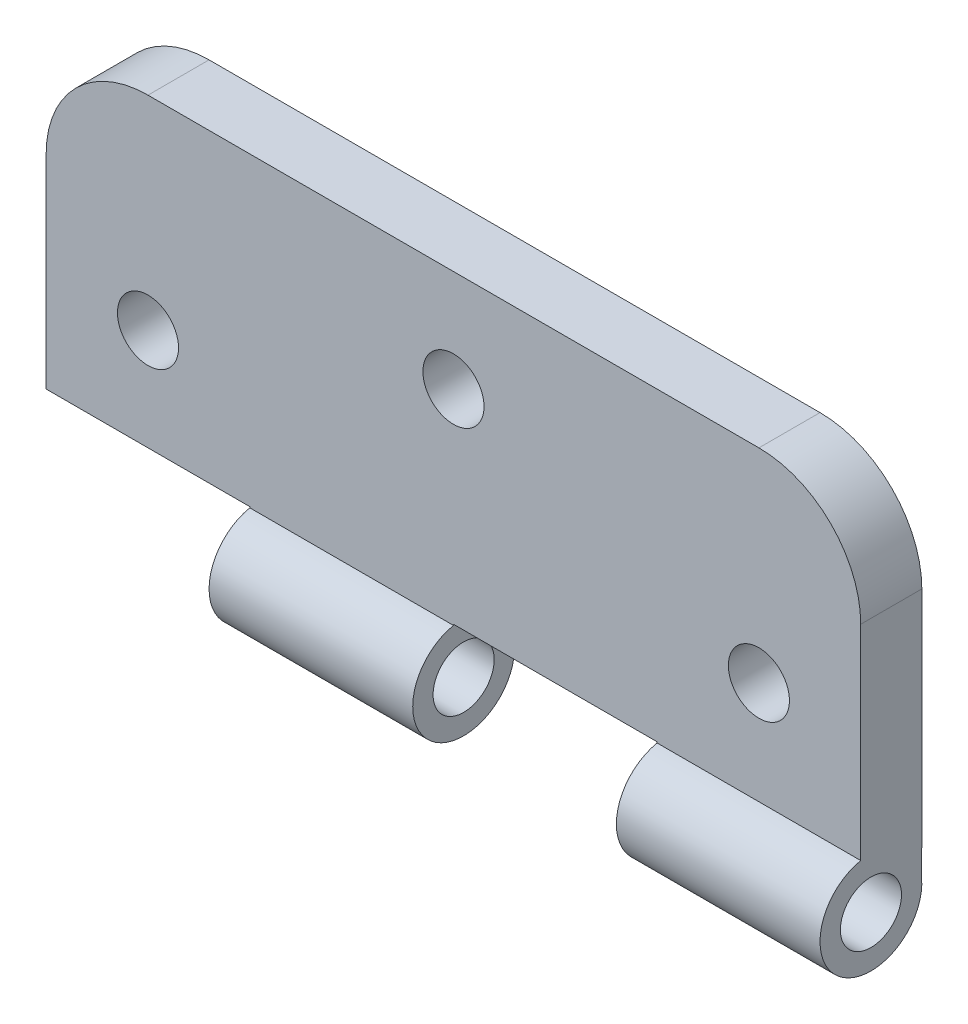
ISO-10303-21;
HEADER;
FILE_DESCRIPTION(('STEP AP214'),'2;1');
FILE_NAME('part.step','',(''),(''),'','','');
FILE_SCHEMA(('AUTOMOTIVE_DESIGN { 1 0 10303 214 1 1 1 1 }'));
ENDSEC;
DATA;
#1=APPLICATION_CONTEXT('core data for automotive mechanical design processes');
#2=APPLICATION_PROTOCOL_DEFINITION('international standard','automotive_design',2000,#1);
#3=PRODUCT_CONTEXT('',#1,'mechanical');
#4=PRODUCT('Part','Part','',(#3));
#5=PRODUCT_RELATED_PRODUCT_CATEGORY('part','',(#4));
#6=PRODUCT_DEFINITION_FORMATION('','',#4);
#7=PRODUCT_DEFINITION_CONTEXT('part definition',#1,'design');
#8=PRODUCT_DEFINITION('design','',#6,#7);
#9=PRODUCT_DEFINITION_SHAPE('','',#8);
#10=(LENGTH_UNIT() NAMED_UNIT(*) SI_UNIT(.MILLI.,.METRE.));
#11=(NAMED_UNIT(*) PLANE_ANGLE_UNIT() SI_UNIT($,.RADIAN.));
#12=(NAMED_UNIT(*) SI_UNIT($,.STERADIAN.) SOLID_ANGLE_UNIT());
#13=UNCERTAINTY_MEASURE_WITH_UNIT(LENGTH_MEASURE(1.E-05),#10,'distance_accuracy_value','');
#14=(GEOMETRIC_REPRESENTATION_CONTEXT(3) GLOBAL_UNCERTAINTY_ASSIGNED_CONTEXT((#13)) GLOBAL_UNIT_ASSIGNED_CONTEXT((#10,
#11,#12)) REPRESENTATION_CONTEXT('',''));
#15=CARTESIAN_POINT('',(0.,0.,0.));
#16=DIRECTION('',(0.,0.,1.));
#17=DIRECTION('',(1.,0.,0.));
#18=AXIS2_PLACEMENT_3D('',#15,#16,#17);
#19=CARTESIAN_POINT('',(-20.,-7.5,3.));
#20=DIRECTION('',(0.,1.,0.));
#21=DIRECTION('',(0.,0.,1.));
#22=AXIS2_PLACEMENT_3D('',#19,#20,#21);
#23=PLANE('',#22);
#24=DIRECTION('',(0.,0.,-1.));
#25=VECTOR('',#24,1.);
#26=CARTESIAN_POINT('',(-10.,-7.5,0.));
#27=LINE('',#26,#25);
#28=CARTESIAN_POINT('',(-10.,-7.5,3.));
#29=VERTEX_POINT('',#28);
#30=CARTESIAN_POINT('',(-10.,-7.5,0.));
#31=VERTEX_POINT('',#30);
#32=EDGE_CURVE('E56',#29,#31,#27,.T.);
#33=ORIENTED_EDGE('',*,*,#32,.F.);
#34=DIRECTION('',(1.,0.,0.));
#35=VECTOR('',#34,1.);
#36=CARTESIAN_POINT('',(-20.,-7.5,3.));
#37=LINE('',#36,#35);
#38=CARTESIAN_POINT('',(-20.,-7.5,3.));
#39=VERTEX_POINT('',#38);
#40=EDGE_CURVE('E151',#39,#29,#37,.T.);
#41=ORIENTED_EDGE('',*,*,#40,.F.);
#42=DIRECTION('',(0.,0.,-1.));
#43=VECTOR('',#42,1.);
#44=CARTESIAN_POINT('',(-20.,-7.5,3.));
#45=LINE('',#44,#43);
#46=CARTESIAN_POINT('',(-20.,-7.5,0.));
#47=VERTEX_POINT('',#46);
#48=EDGE_CURVE('E236',#39,#47,#45,.T.);
#49=ORIENTED_EDGE('',*,*,#48,.T.);
#50=DIRECTION('',(1.,0.,0.));
#51=VECTOR('',#50,1.);
#52=CARTESIAN_POINT('',(-20.,-7.5,0.));
#53=LINE('',#52,#51);
#54=EDGE_CURVE('E227',#47,#31,#53,.T.);
#55=ORIENTED_EDGE('',*,*,#54,.T.);
#56=EDGE_LOOP('',(#33,#41,#49,#55));
#57=FACE_BOUND('',#56,.T.);
#58=ADVANCED_FACE('F33',(#57),#23,.F.);
#59=CARTESIAN_POINT('',(0.,-7.5,3.));
#60=VERTEX_POINT('',#59);
#61=CARTESIAN_POINT('',(9.99999999999999,-7.5,3.));
#62=VERTEX_POINT('',#61);
#63=EDGE_CURVE('E48',#60,#62,#37,.T.);
#64=ORIENTED_EDGE('',*,*,#63,.F.);
#65=DIRECTION('',(0.,0.,-1.));
#66=VECTOR('',#65,1.);
#67=CARTESIAN_POINT('',(0.,-7.5,0.));
#68=LINE('',#67,#66);
#69=CARTESIAN_POINT('',(0.,-7.5,0.));
#70=VERTEX_POINT('',#69);
#71=EDGE_CURVE('E155',#60,#70,#68,.T.);
#72=ORIENTED_EDGE('',*,*,#71,.T.);
#73=CARTESIAN_POINT('',(9.99999999999999,-7.5,0.));
#74=VERTEX_POINT('',#73);
#75=EDGE_CURVE('E247',#70,#74,#53,.T.);
#76=ORIENTED_EDGE('',*,*,#75,.T.);
#77=DIRECTION('',(0.,0.,-1.));
#78=VECTOR('',#77,1.);
#79=CARTESIAN_POINT('',(9.99999999999999,-7.5,0.));
#80=LINE('',#79,#78);
#81=EDGE_CURVE('E187',#62,#74,#80,.T.);
#82=ORIENTED_EDGE('',*,*,#81,.F.);
#83=EDGE_LOOP('',(#64,#72,#76,#82));
#84=FACE_BOUND('',#83,.T.);
#85=ADVANCED_FACE('F292',(#84),#23,.F.);
#86=CARTESIAN_POINT('',(-15.,2.5,3.));
#87=DIRECTION('',(0.,0.,1.));
#88=DIRECTION('',(1.,0.,0.));
#89=AXIS2_PLACEMENT_3D('',#86,#87,#88);
#90=PLANE('',#89);
#91=CARTESIAN_POINT('',(15.,-2.5,3.));
#92=DIRECTION('',(0.,0.,1.));
#93=DIRECTION('',(-1.,0.,0.));
#94=AXIS2_PLACEMENT_3D('',#91,#92,#93);
#95=CIRCLE('',#94,1.5);
#96=CARTESIAN_POINT('',(13.5,-2.5,3.));
#97=VERTEX_POINT('',#96);
#98=EDGE_CURVE('E212',#97,#97,#95,.T.);
#99=ORIENTED_EDGE('',*,*,#98,.F.);
#100=EDGE_LOOP('',(#99));
#101=FACE_BOUND('',#100,.T.);
#102=DIRECTION('',(0.,1.,0.));
#103=VECTOR('',#102,1.);
#104=CARTESIAN_POINT('',(20.,2.49999999999997,3.));
#105=LINE('',#104,#103);
#106=CARTESIAN_POINT('',(20.,-7.55051025721682,3.));
#107=VERTEX_POINT('',#106);
#108=CARTESIAN_POINT('',(20.,2.49999999999997,3.));
#109=VERTEX_POINT('',#108);
#110=EDGE_CURVE('E224',#107,#109,#105,.T.);
#111=ORIENTED_EDGE('',*,*,#110,.T.);
#112=CARTESIAN_POINT('',(15.,2.5,3.));
#113=DIRECTION('',(0.,0.,1.));
#114=DIRECTION('',(-1.,0.,0.));
#115=AXIS2_PLACEMENT_3D('',#112,#113,#114);
#116=CIRCLE('',#115,5.);
#117=CARTESIAN_POINT('',(15.,7.5,3.));
#118=VERTEX_POINT('',#117);
#119=EDGE_CURVE('E226',#109,#118,#116,.T.);
#120=ORIENTED_EDGE('',*,*,#119,.T.);
#121=DIRECTION('',(-1.,0.,0.));
#122=VECTOR('',#121,1.);
#123=CARTESIAN_POINT('',(-15.,7.5,3.));
#124=LINE('',#123,#122);
#125=CARTESIAN_POINT('',(-15.,7.5,3.));
#126=VERTEX_POINT('',#125);
#127=EDGE_CURVE('E229',#118,#126,#124,.T.);
#128=ORIENTED_EDGE('',*,*,#127,.T.);
#129=CARTESIAN_POINT('',(-15.,2.5,3.));
#130=DIRECTION('',(0.,0.,1.));
#131=DIRECTION('',(1.,0.,0.));
#132=AXIS2_PLACEMENT_3D('',#129,#130,#131);
#133=CIRCLE('',#132,5.);
#134=CARTESIAN_POINT('',(-20.,2.49999999999997,3.));
#135=VERTEX_POINT('',#134);
#136=EDGE_CURVE('E231',#126,#135,#133,.T.);
#137=ORIENTED_EDGE('',*,*,#136,.T.);
#138=DIRECTION('',(0.,-1.,0.));
#139=VECTOR('',#138,1.);
#140=CARTESIAN_POINT('',(-20.,2.49999999999997,3.));
#141=LINE('',#140,#139);
#142=EDGE_CURVE('E233',#135,#39,#141,.T.);
#143=ORIENTED_EDGE('',*,*,#142,.T.);
#144=ORIENTED_EDGE('',*,*,#40,.T.);
#145=DIRECTION('',(0.,-1.,0.));
#146=VECTOR('',#145,1.);
#147=CARTESIAN_POINT('',(-10.,0.,3.));
#148=LINE('',#147,#146);
#149=CARTESIAN_POINT('',(-10.,-7.55051025721682,3.));
#150=VERTEX_POINT('',#149);
#151=EDGE_CURVE('E143',#29,#150,#148,.T.);
#152=ORIENTED_EDGE('',*,*,#151,.T.);
#153=DIRECTION('',(1.,0.,0.));
#154=VECTOR('',#153,1.);
#155=CARTESIAN_POINT('',(-10.,-7.55051025721682,3.));
#156=LINE('',#155,#154);
#157=CARTESIAN_POINT('',(0.,-7.55051025721682,3.));
#158=VERTEX_POINT('',#157);
#159=EDGE_CURVE('E128',#150,#158,#156,.T.);
#160=ORIENTED_EDGE('',*,*,#159,.T.);
#161=DIRECTION('',(0.,-1.,0.));
#162=VECTOR('',#161,1.);
#163=CARTESIAN_POINT('',(0.,0.,3.));
#164=LINE('',#163,#162);
#165=EDGE_CURVE('E163',#60,#158,#164,.T.);
#166=ORIENTED_EDGE('',*,*,#165,.F.);
#167=ORIENTED_EDGE('',*,*,#63,.T.);
#168=DIRECTION('',(0.,-1.,0.));
#169=VECTOR('',#168,1.);
#170=CARTESIAN_POINT('',(9.99999999999999,0.,3.));
#171=LINE('',#170,#169);
#172=CARTESIAN_POINT('',(9.99999999999999,-7.55051025721682,3.));
#173=VERTEX_POINT('',#172);
#174=EDGE_CURVE('E178',#62,#173,#171,.T.);
#175=ORIENTED_EDGE('',*,*,#174,.T.);
#176=DIRECTION('',(1.,0.,0.));
#177=VECTOR('',#176,1.);
#178=CARTESIAN_POINT('',(9.99999999999999,-7.55051025721682,3.));
#179=LINE('',#178,#177);
#180=EDGE_CURVE('E190',#173,#107,#179,.T.);
#181=ORIENTED_EDGE('',*,*,#180,.T.);
#182=EDGE_LOOP('',(#111,#120,#128,#137,#143,#144,#152,#160,#166,#167,#175,#181));
#183=FACE_BOUND('',#182,.T.);
#184=CARTESIAN_POINT('',(-15.,-2.5,3.));
#185=DIRECTION('',(0.,0.,1.));
#186=DIRECTION('',(1.,0.,0.));
#187=AXIS2_PLACEMENT_3D('',#184,#185,#186);
#188=CIRCLE('',#187,1.5);
#189=CARTESIAN_POINT('',(-13.5,-2.5,3.));
#190=VERTEX_POINT('',#189);
#191=EDGE_CURVE('E218',#190,#190,#188,.T.);
#192=ORIENTED_EDGE('',*,*,#191,.F.);
#193=EDGE_LOOP('',(#192));
#194=FACE_BOUND('',#193,.T.);
#195=CARTESIAN_POINT('',(0.,2.5,3.));
#196=DIRECTION('',(0.,0.,1.));
#197=DIRECTION('',(1.,0.,0.));
#198=AXIS2_PLACEMENT_3D('',#195,#196,#197);
#199=CIRCLE('',#198,1.5);
#200=CARTESIAN_POINT('',(1.5,2.5,3.));
#201=VERTEX_POINT('',#200);
#202=EDGE_CURVE('E206',#201,#201,#199,.T.);
#203=ORIENTED_EDGE('',*,*,#202,.F.);
#204=EDGE_LOOP('',(#203));
#205=FACE_BOUND('',#204,.T.);
#206=ADVANCED_FACE('F149',(#101,#183,#194,#205),#90,.T.);
#207=CARTESIAN_POINT('',(-15.,2.5,0.));
#208=DIRECTION('',(0.,0.,1.));
#209=DIRECTION('',(1.,0.,0.));
#210=AXIS2_PLACEMENT_3D('',#207,#208,#209);
#211=PLANE('',#210);
#212=DIRECTION('',(0.,1.,0.));
#213=VECTOR('',#212,1.);
#214=CARTESIAN_POINT('',(20.,2.49999999999997,0.));
#215=LINE('',#214,#213);
#216=CARTESIAN_POINT('',(20.,-7.5,0.));
#217=VERTEX_POINT('',#216);
#218=CARTESIAN_POINT('',(20.,2.49999999999997,0.));
#219=VERTEX_POINT('',#218);
#220=EDGE_CURVE('E221',#217,#219,#215,.T.);
#221=ORIENTED_EDGE('',*,*,#220,.F.);
#222=DIRECTION('',(1.,0.,0.));
#223=VECTOR('',#222,1.);
#224=CARTESIAN_POINT('',(9.99999999999999,-7.5,0.));
#225=LINE('',#224,#223);
#226=EDGE_CURVE('E198',#74,#217,#225,.T.);
#227=ORIENTED_EDGE('',*,*,#226,.F.);
#228=ORIENTED_EDGE('',*,*,#75,.F.);
#229=DIRECTION('',(1.,0.,0.));
#230=VECTOR('',#229,1.);
#231=CARTESIAN_POINT('',(-10.,-7.5,0.));
#232=LINE('',#231,#230);
#233=EDGE_CURVE('E170',#31,#70,#232,.T.);
#234=ORIENTED_EDGE('',*,*,#233,.F.);
#235=ORIENTED_EDGE('',*,*,#54,.F.);
#236=DIRECTION('',(0.,-1.,0.));
#237=VECTOR('',#236,1.);
#238=CARTESIAN_POINT('',(-20.,2.49999999999997,0.));
#239=LINE('',#238,#237);
#240=CARTESIAN_POINT('',(-20.,2.49999999999997,0.));
#241=VERTEX_POINT('',#240);
#242=EDGE_CURVE('E245',#241,#47,#239,.T.);
#243=ORIENTED_EDGE('',*,*,#242,.F.);
#244=CARTESIAN_POINT('',(-15.,2.5,0.));
#245=DIRECTION('',(0.,0.,1.));
#246=DIRECTION('',(1.,0.,0.));
#247=AXIS2_PLACEMENT_3D('',#244,#245,#246);
#248=CIRCLE('',#247,5.);
#249=CARTESIAN_POINT('',(-15.,7.5,0.));
#250=VERTEX_POINT('',#249);
#251=EDGE_CURVE('E243',#250,#241,#248,.T.);
#252=ORIENTED_EDGE('',*,*,#251,.F.);
#253=DIRECTION('',(-1.,0.,0.));
#254=VECTOR('',#253,1.);
#255=CARTESIAN_POINT('',(-15.,7.5,0.));
#256=LINE('',#255,#254);
#257=CARTESIAN_POINT('',(15.,7.5,0.));
#258=VERTEX_POINT('',#257);
#259=EDGE_CURVE('E241',#258,#250,#256,.T.);
#260=ORIENTED_EDGE('',*,*,#259,.F.);
#261=CARTESIAN_POINT('',(15.,2.5,0.));
#262=DIRECTION('',(0.,0.,1.));
#263=DIRECTION('',(-1.,0.,0.));
#264=AXIS2_PLACEMENT_3D('',#261,#262,#263);
#265=CIRCLE('',#264,5.);
#266=EDGE_CURVE('E239',#219,#258,#265,.T.);
#267=ORIENTED_EDGE('',*,*,#266,.F.);
#268=EDGE_LOOP('',(#221,#227,#228,#234,#235,#243,#252,#260,#267));
#269=FACE_BOUND('',#268,.T.);
#270=CARTESIAN_POINT('',(-15.,-2.5,0.));
#271=DIRECTION('',(0.,0.,1.));
#272=DIRECTION('',(1.,0.,0.));
#273=AXIS2_PLACEMENT_3D('',#270,#271,#272);
#274=CIRCLE('',#273,1.5);
#275=CARTESIAN_POINT('',(-13.5,-2.5,0.));
#276=VERTEX_POINT('',#275);
#277=EDGE_CURVE('E215',#276,#276,#274,.T.);
#278=ORIENTED_EDGE('',*,*,#277,.T.);
#279=EDGE_LOOP('',(#278));
#280=FACE_BOUND('',#279,.T.);
#281=CARTESIAN_POINT('',(15.,-2.5,0.));
#282=DIRECTION('',(0.,0.,1.));
#283=DIRECTION('',(-1.,0.,0.));
#284=AXIS2_PLACEMENT_3D('',#281,#282,#283);
#285=CIRCLE('',#284,1.5);
#286=CARTESIAN_POINT('',(13.5,-2.5,0.));
#287=VERTEX_POINT('',#286);
#288=EDGE_CURVE('E209',#287,#287,#285,.T.);
#289=ORIENTED_EDGE('',*,*,#288,.T.);
#290=EDGE_LOOP('',(#289));
#291=FACE_BOUND('',#290,.T.);
#292=CARTESIAN_POINT('',(0.,2.5,0.));
#293=DIRECTION('',(0.,0.,1.));
#294=DIRECTION('',(1.,0.,0.));
#295=AXIS2_PLACEMENT_3D('',#292,#293,#294);
#296=CIRCLE('',#295,1.5);
#297=CARTESIAN_POINT('',(1.5,2.5,0.));
#298=VERTEX_POINT('',#297);
#299=EDGE_CURVE('E201',#298,#298,#296,.T.);
#300=ORIENTED_EDGE('',*,*,#299,.T.);
#301=EDGE_LOOP('',(#300));
#302=FACE_BOUND('',#301,.T.);
#303=ADVANCED_FACE('F266',(#269,#280,#291,#302),#211,.F.);
#304=CARTESIAN_POINT('',(20.,2.49999999999997,3.));
#305=DIRECTION('',(-1.,0.,0.));
#306=DIRECTION('',(0.,0.,1.));
#307=AXIS2_PLACEMENT_3D('',#304,#305,#306);
#308=PLANE('',#307);
#309=ORIENTED_EDGE('',*,*,#220,.T.);
#310=DIRECTION('',(0.,0.,-1.));
#311=VECTOR('',#310,1.);
#312=CARTESIAN_POINT('',(20.,2.49999999999997,3.));
#313=LINE('',#312,#311);
#314=EDGE_CURVE('E11',#109,#219,#313,.T.);
#315=ORIENTED_EDGE('',*,*,#314,.F.);
#316=ORIENTED_EDGE('',*,*,#110,.F.);
#317=CARTESIAN_POINT('',(20.,-10.,2.5));
#318=DIRECTION('',(1.,0.,0.));
#319=DIRECTION('',(0.,0.,-1.));
#320=AXIS2_PLACEMENT_3D('',#317,#318,#319);
#321=CIRCLE('',#320,2.5);
#322=CARTESIAN_POINT('',(20.,-9.78241924590967,0.00948627479198817));
#323=VERTEX_POINT('',#322);
#324=EDGE_CURVE('E193',#107,#323,#321,.T.);
#325=ORIENTED_EDGE('',*,*,#324,.T.);
#326=DIRECTION('',(0.,-0.999991362959859,0.0041562008713571));
#327=VECTOR('',#326,1.);
#328=CARTESIAN_POINT('',(20.,-0.000129555042623021,-0.031171237305625));
#329=LINE('',#328,#327);
#330=EDGE_CURVE('E179',#217,#323,#329,.T.);
#331=ORIENTED_EDGE('',*,*,#330,.F.);
#332=EDGE_LOOP('',(#309,#315,#316,#325,#331));
#333=FACE_BOUND('',#332,.T.);
#334=CARTESIAN_POINT('',(20.,-10.,2.5));
#335=DIRECTION('',(1.,0.,0.));
#336=DIRECTION('',(0.,0.,-1.));
#337=AXIS2_PLACEMENT_3D('',#334,#335,#336);
#338=CIRCLE('',#337,1.5);
#339=CARTESIAN_POINT('',(20.,-10.,1.));
#340=VERTEX_POINT('',#339);
#341=EDGE_CURVE('E173',#340,#340,#338,.T.);
#342=ORIENTED_EDGE('',*,*,#341,.F.);
#343=EDGE_LOOP('',(#342));
#344=FACE_BOUND('',#343,.T.);
#345=ADVANCED_FACE('F35',(#333,#344),#308,.F.);
#346=CARTESIAN_POINT('',(15.,2.5,3.));
#347=DIRECTION('',(0.,0.,-1.));
#348=DIRECTION('',(-1.,0.,0.));
#349=AXIS2_PLACEMENT_3D('',#346,#347,#348);
#350=CYLINDRICAL_SURFACE('',#349,5.);
#351=ORIENTED_EDGE('',*,*,#266,.T.);
#352=DIRECTION('',(0.,0.,-1.));
#353=VECTOR('',#352,1.);
#354=CARTESIAN_POINT('',(15.,7.5,3.));
#355=LINE('',#354,#353);
#356=EDGE_CURVE('E41',#118,#258,#355,.T.);
#357=ORIENTED_EDGE('',*,*,#356,.F.);
#358=ORIENTED_EDGE('',*,*,#119,.F.);
#359=ORIENTED_EDGE('',*,*,#314,.T.);
#360=EDGE_LOOP('',(#351,#357,#358,#359));
#361=FACE_BOUND('',#360,.T.);
#362=ADVANCED_FACE('F279',(#361),#350,.T.);
#363=CARTESIAN_POINT('',(-15.,7.5,3.));
#364=DIRECTION('',(0.,-1.,0.));
#365=DIRECTION('',(0.,0.,-1.));
#366=AXIS2_PLACEMENT_3D('',#363,#364,#365);
#367=PLANE('',#366);
#368=ORIENTED_EDGE('',*,*,#259,.T.);
#369=DIRECTION('',(0.,0.,-1.));
#370=VECTOR('',#369,1.);
#371=CARTESIAN_POINT('',(-15.,7.5,3.));
#372=LINE('',#371,#370);
#373=EDGE_CURVE('E254',#126,#250,#372,.T.);
#374=ORIENTED_EDGE('',*,*,#373,.F.);
#375=ORIENTED_EDGE('',*,*,#127,.F.);
#376=ORIENTED_EDGE('',*,*,#356,.T.);
#377=EDGE_LOOP('',(#368,#374,#375,#376));
#378=FACE_BOUND('',#377,.T.);
#379=ADVANCED_FACE('F261',(#378),#367,.F.);
#380=CARTESIAN_POINT('',(-15.,2.5,3.));
#381=DIRECTION('',(0.,0.,-1.));
#382=DIRECTION('',(-1.,0.,0.));
#383=AXIS2_PLACEMENT_3D('',#380,#381,#382);
#384=CYLINDRICAL_SURFACE('',#383,5.);
#385=ORIENTED_EDGE('',*,*,#251,.T.);
#386=DIRECTION('',(0.,0.,-1.));
#387=VECTOR('',#386,1.);
#388=CARTESIAN_POINT('',(-20.,2.49999999999997,3.));
#389=LINE('',#388,#387);
#390=EDGE_CURVE('E251',#135,#241,#389,.T.);
#391=ORIENTED_EDGE('',*,*,#390,.F.);
#392=ORIENTED_EDGE('',*,*,#136,.F.);
#393=ORIENTED_EDGE('',*,*,#373,.T.);
#394=EDGE_LOOP('',(#385,#391,#392,#393));
#395=FACE_BOUND('',#394,.T.);
#396=ADVANCED_FACE('F272',(#395),#384,.T.);
#397=CARTESIAN_POINT('',(-20.,2.49999999999997,3.));
#398=DIRECTION('',(1.,0.,0.));
#399=DIRECTION('',(0.,1.,0.));
#400=AXIS2_PLACEMENT_3D('',#397,#398,#399);
#401=PLANE('',#400);
#402=ORIENTED_EDGE('',*,*,#242,.T.);
#403=ORIENTED_EDGE('',*,*,#48,.F.);
#404=ORIENTED_EDGE('',*,*,#142,.F.);
#405=ORIENTED_EDGE('',*,*,#390,.T.);
#406=EDGE_LOOP('',(#402,#403,#404,#405));
#407=FACE_BOUND('',#406,.T.);
#408=ADVANCED_FACE('F276',(#407),#401,.F.);
#409=CARTESIAN_POINT('',(-15.,-2.5,3.));
#410=DIRECTION('',(0.,0.,-1.));
#411=DIRECTION('',(-1.,0.,0.));
#412=AXIS2_PLACEMENT_3D('',#409,#410,#411);
#413=CYLINDRICAL_SURFACE('',#412,1.5);
#414=ORIENTED_EDGE('',*,*,#191,.T.);
#415=EDGE_LOOP('',(#414));
#416=FACE_BOUND('',#415,.T.);
#417=ORIENTED_EDGE('',*,*,#277,.F.);
#418=EDGE_LOOP('',(#417));
#419=FACE_BOUND('',#418,.T.);
#420=ADVANCED_FACE('F308',(#416,#419),#413,.F.);
#421=CARTESIAN_POINT('',(15.,-2.5,3.));
#422=DIRECTION('',(0.,0.,-1.));
#423=DIRECTION('',(-1.,0.,0.));
#424=AXIS2_PLACEMENT_3D('',#421,#422,#423);
#425=CYLINDRICAL_SURFACE('',#424,1.5);
#426=ORIENTED_EDGE('',*,*,#98,.T.);
#427=EDGE_LOOP('',(#426));
#428=FACE_BOUND('',#427,.T.);
#429=ORIENTED_EDGE('',*,*,#288,.F.);
#430=EDGE_LOOP('',(#429));
#431=FACE_BOUND('',#430,.T.);
#432=ADVANCED_FACE('F329',(#428,#431),#425,.F.);
#433=CARTESIAN_POINT('',(0.,2.5,3.));
#434=DIRECTION('',(0.,0.,-1.));
#435=DIRECTION('',(-1.,0.,0.));
#436=AXIS2_PLACEMENT_3D('',#433,#434,#435);
#437=CYLINDRICAL_SURFACE('',#436,1.5);
#438=ORIENTED_EDGE('',*,*,#202,.T.);
#439=EDGE_LOOP('',(#438));
#440=FACE_BOUND('',#439,.T.);
#441=ORIENTED_EDGE('',*,*,#299,.F.);
#442=EDGE_LOOP('',(#441));
#443=FACE_BOUND('',#442,.T.);
#444=ADVANCED_FACE('F333',(#440,#443),#437,.F.);
#445=CARTESIAN_POINT('',(9.99999999999999,-0.000129555042623021,-0.031171237305625));
#446=DIRECTION('',(0.,0.0041562008713571,0.999991362959859));
#447=DIRECTION('',(0.,-0.999991362959859,0.0041562008713571));
#448=AXIS2_PLACEMENT_3D('',#445,#446,#447);
#449=PLANE('',#448);
#450=ORIENTED_EDGE('',*,*,#330,.T.);
#451=DIRECTION('',(1.,0.,0.));
#452=VECTOR('',#451,1.);
#453=CARTESIAN_POINT('',(9.99999999999999,-9.78241924590967,0.00948627479198817));
#454=LINE('',#453,#452);
#455=CARTESIAN_POINT('',(9.99999999999999,-9.78241924590967,0.00948627479198817));
#456=VERTEX_POINT('',#455);
#457=EDGE_CURVE('E202',#456,#323,#454,.T.);
#458=ORIENTED_EDGE('',*,*,#457,.F.);
#459=DIRECTION('',(0.,-0.999991362959859,0.0041562008713571));
#460=VECTOR('',#459,1.);
#461=CARTESIAN_POINT('',(9.99999999999999,-0.000129555042623021,-0.031171237305625));
#462=LINE('',#461,#460);
#463=EDGE_CURVE('E185',#74,#456,#462,.T.);
#464=ORIENTED_EDGE('',*,*,#463,.F.);
#465=ORIENTED_EDGE('',*,*,#226,.T.);
#466=EDGE_LOOP('',(#450,#458,#464,#465));
#467=FACE_BOUND('',#466,.T.);
#468=ADVANCED_FACE('F287',(#467),#449,.F.);
#469=CARTESIAN_POINT('',(9.99999999999999,-10.,2.5));
#470=DIRECTION('',(1.,0.,0.));
#471=DIRECTION('',(0.,0.,-1.));
#472=AXIS2_PLACEMENT_3D('',#469,#470,#471);
#473=CYLINDRICAL_SURFACE('',#472,1.5);
#474=CARTESIAN_POINT('',(9.99999999999999,-10.,2.5));
#475=DIRECTION('',(1.,0.,0.));
#476=DIRECTION('',(0.,0.,-1.));
#477=AXIS2_PLACEMENT_3D('',#474,#475,#476);
#478=CIRCLE('',#477,1.5);
#479=CARTESIAN_POINT('',(9.99999999999999,-10.,1.));
#480=VERTEX_POINT('',#479);
#481=EDGE_CURVE('E175',#480,#480,#478,.T.);
#482=ORIENTED_EDGE('',*,*,#481,.F.);
#483=EDGE_LOOP('',(#482));
#484=FACE_BOUND('',#483,.T.);
#485=ORIENTED_EDGE('',*,*,#341,.T.);
#486=EDGE_LOOP('',(#485));
#487=FACE_BOUND('',#486,.T.);
#488=ADVANCED_FACE('F338',(#484,#487),#473,.F.);
#489=CARTESIAN_POINT('',(9.99999999999999,-10.,2.5));
#490=DIRECTION('',(1.,0.,0.));
#491=DIRECTION('',(0.,0.,-1.));
#492=AXIS2_PLACEMENT_3D('',#489,#490,#491);
#493=CYLINDRICAL_SURFACE('',#492,2.5);
#494=ORIENTED_EDGE('',*,*,#324,.F.);
#495=ORIENTED_EDGE('',*,*,#180,.F.);
#496=CARTESIAN_POINT('',(9.99999999999999,-10.,2.5));
#497=DIRECTION('',(1.,0.,0.));
#498=DIRECTION('',(0.,0.,-1.));
#499=AXIS2_PLACEMENT_3D('',#496,#497,#498);
#500=CIRCLE('',#499,2.5);
#501=EDGE_CURVE('E182',#173,#456,#500,.T.);
#502=ORIENTED_EDGE('',*,*,#501,.T.);
#503=ORIENTED_EDGE('',*,*,#457,.T.);
#504=EDGE_LOOP('',(#494,#495,#502,#503));
#505=FACE_BOUND('',#504,.T.);
#506=ADVANCED_FACE('F341',(#505),#493,.T.);
#507=CARTESIAN_POINT('',(9.99999999999999,0.,0.));
#508=DIRECTION('',(1.,0.,0.));
#509=DIRECTION('',(0.,0.,-1.));
#510=AXIS2_PLACEMENT_3D('',#507,#508,#509);
#511=PLANE('',#510);
#512=ORIENTED_EDGE('',*,*,#481,.T.);
#513=EDGE_LOOP('',(#512));
#514=FACE_BOUND('',#513,.T.);
#515=ORIENTED_EDGE('',*,*,#174,.F.);
#516=ORIENTED_EDGE('',*,*,#81,.T.);
#517=ORIENTED_EDGE('',*,*,#463,.T.);
#518=ORIENTED_EDGE('',*,*,#501,.F.);
#519=EDGE_LOOP('',(#515,#516,#517,#518));
#520=FACE_BOUND('',#519,.T.);
#521=ADVANCED_FACE('F291',(#514,#520),#511,.F.);
#522=CARTESIAN_POINT('',(-10.,-0.000129555042623021,-0.031171237305625));
#523=DIRECTION('',(0.,0.0041562008713571,0.999991362959859));
#524=DIRECTION('',(0.,-0.999991362959859,0.0041562008713571));
#525=AXIS2_PLACEMENT_3D('',#522,#523,#524);
#526=PLANE('',#525);
#527=DIRECTION('',(0.,-0.999991362959859,0.0041562008713571));
#528=VECTOR('',#527,1.);
#529=CARTESIAN_POINT('',(0.,-0.000129555042623021,-0.031171237305625));
#530=LINE('',#529,#528);
#531=CARTESIAN_POINT('',(0.,-9.78241924590967,0.00948627479198817));
#532=VERTEX_POINT('',#531);
#533=EDGE_CURVE('E166',#70,#532,#530,.T.);
#534=ORIENTED_EDGE('',*,*,#533,.T.);
#535=DIRECTION('',(1.,0.,0.));
#536=VECTOR('',#535,1.);
#537=CARTESIAN_POINT('',(-10.,-9.78241924590967,0.00948627479198817));
#538=LINE('',#537,#536);
#539=CARTESIAN_POINT('',(-10.,-9.78241924590967,0.00948627479198817));
#540=VERTEX_POINT('',#539);
#541=EDGE_CURVE('E138',#540,#532,#538,.T.);
#542=ORIENTED_EDGE('',*,*,#541,.F.);
#543=DIRECTION('',(0.,-0.999991362959859,0.0041562008713571));
#544=VECTOR('',#543,1.);
#545=CARTESIAN_POINT('',(-10.,-0.000129555042623021,-0.031171237305625));
#546=LINE('',#545,#544);
#547=EDGE_CURVE('E145',#31,#540,#546,.T.);
#548=ORIENTED_EDGE('',*,*,#547,.F.);
#549=ORIENTED_EDGE('',*,*,#233,.T.);
#550=EDGE_LOOP('',(#534,#542,#548,#549));
#551=FACE_BOUND('',#550,.T.);
#552=ADVANCED_FACE('F297',(#551),#526,.F.);
#553=CARTESIAN_POINT('',(-10.,-10.,2.5));
#554=DIRECTION('',(1.,0.,0.));
#555=DIRECTION('',(0.,0.,-1.));
#556=AXIS2_PLACEMENT_3D('',#553,#554,#555);
#557=CYLINDRICAL_SURFACE('',#556,1.5);
#558=CARTESIAN_POINT('',(-10.,-10.,2.5));
#559=DIRECTION('',(1.,0.,0.));
#560=DIRECTION('',(0.,0.,-1.));
#561=AXIS2_PLACEMENT_3D('',#558,#559,#560);
#562=CIRCLE('',#561,1.5);
#563=CARTESIAN_POINT('',(-10.,-10.,1.));
#564=VERTEX_POINT('',#563);
#565=EDGE_CURVE('E152',#564,#564,#562,.T.);
#566=ORIENTED_EDGE('',*,*,#565,.F.);
#567=EDGE_LOOP('',(#566));
#568=FACE_BOUND('',#567,.T.);
#569=CARTESIAN_POINT('',(0.,-10.,2.5));
#570=DIRECTION('',(1.,0.,0.));
#571=DIRECTION('',(0.,0.,-1.));
#572=AXIS2_PLACEMENT_3D('',#569,#570,#571);
#573=CIRCLE('',#572,1.5);
#574=CARTESIAN_POINT('',(0.,-10.,1.));
#575=VERTEX_POINT('',#574);
#576=EDGE_CURVE('E160',#575,#575,#573,.T.);
#577=ORIENTED_EDGE('',*,*,#576,.T.);
#578=EDGE_LOOP('',(#577));
#579=FACE_BOUND('',#578,.T.);
#580=ADVANCED_FACE('F351',(#568,#579),#557,.F.);
#581=CARTESIAN_POINT('',(-10.,-10.,2.5));
#582=DIRECTION('',(1.,0.,0.));
#583=DIRECTION('',(0.,0.,-1.));
#584=AXIS2_PLACEMENT_3D('',#581,#582,#583);
#585=CYLINDRICAL_SURFACE('',#584,2.5);
#586=CARTESIAN_POINT('',(0.,-10.,2.5));
#587=DIRECTION('',(1.,0.,0.));
#588=DIRECTION('',(0.,0.,-1.));
#589=AXIS2_PLACEMENT_3D('',#586,#587,#588);
#590=CIRCLE('',#589,2.5);
#591=EDGE_CURVE('E133',#158,#532,#590,.T.);
#592=ORIENTED_EDGE('',*,*,#591,.F.);
#593=ORIENTED_EDGE('',*,*,#159,.F.);
#594=CARTESIAN_POINT('',(-10.,-10.,2.5));
#595=DIRECTION('',(1.,0.,0.));
#596=DIRECTION('',(0.,0.,-1.));
#597=AXIS2_PLACEMENT_3D('',#594,#595,#596);
#598=CIRCLE('',#597,2.5);
#599=EDGE_CURVE('E131',#150,#540,#598,.T.);
#600=ORIENTED_EDGE('',*,*,#599,.T.);
#601=ORIENTED_EDGE('',*,*,#541,.T.);
#602=EDGE_LOOP('',(#592,#593,#600,#601));
#603=FACE_BOUND('',#602,.T.);
#604=ADVANCED_FACE('F130',(#603),#585,.T.);
#605=CARTESIAN_POINT('',(-10.,0.,0.));
#606=DIRECTION('',(1.,0.,0.));
#607=DIRECTION('',(0.,0.,-1.));
#608=AXIS2_PLACEMENT_3D('',#605,#606,#607);
#609=PLANE('',#608);
#610=ORIENTED_EDGE('',*,*,#565,.T.);
#611=EDGE_LOOP('',(#610));
#612=FACE_BOUND('',#611,.T.);
#613=ORIENTED_EDGE('',*,*,#151,.F.);
#614=ORIENTED_EDGE('',*,*,#32,.T.);
#615=ORIENTED_EDGE('',*,*,#547,.T.);
#616=ORIENTED_EDGE('',*,*,#599,.F.);
#617=EDGE_LOOP('',(#613,#614,#615,#616));
#618=FACE_BOUND('',#617,.T.);
#619=ADVANCED_FACE('F142',(#612,#618),#609,.F.);
#620=CARTESIAN_POINT('',(0.,0.,0.));
#621=DIRECTION('',(1.,0.,0.));
#622=DIRECTION('',(0.,0.,-1.));
#623=AXIS2_PLACEMENT_3D('',#620,#621,#622);
#624=PLANE('',#623);
#625=ORIENTED_EDGE('',*,*,#576,.F.);
#626=EDGE_LOOP('',(#625));
#627=FACE_BOUND('',#626,.T.);
#628=ORIENTED_EDGE('',*,*,#165,.T.);
#629=ORIENTED_EDGE('',*,*,#591,.T.);
#630=ORIENTED_EDGE('',*,*,#533,.F.);
#631=ORIENTED_EDGE('',*,*,#71,.F.);
#632=EDGE_LOOP('',(#628,#629,#630,#631));
#633=FACE_BOUND('',#632,.T.);
#634=ADVANCED_FACE('F295',(#627,#633),#624,.T.);
#635=CLOSED_SHELL('',(#58,#85,#206,#303,#345,#362,#379,#396,#408,#420,#432,#444,#468,#488,#506,
#521,#552,#580,#604,#619,#634));
#636=MANIFOLD_SOLID_BREP('B2',#635);
#637=ADVANCED_BREP_SHAPE_REPRESENTATION('',(#18,#636),#14);
#638=SHAPE_DEFINITION_REPRESENTATION(#9,#637);
ENDSEC;
END-ISO-10303-21;
